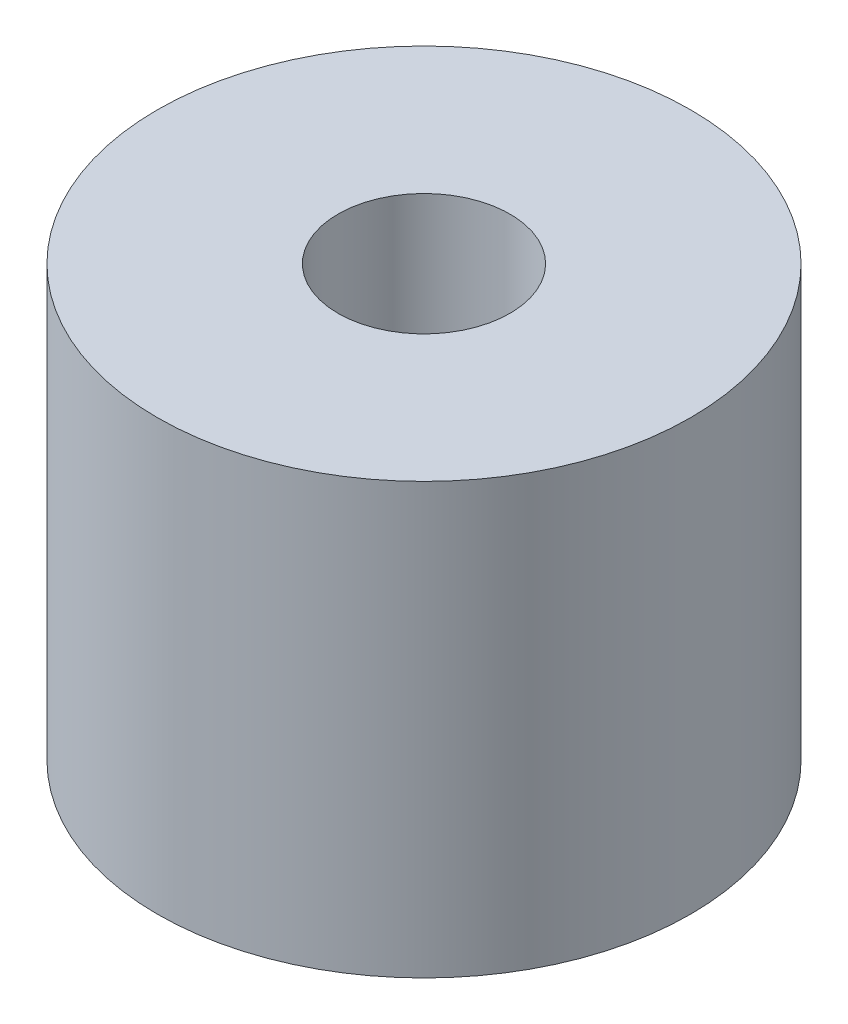
ISO-10303-21;
HEADER;
FILE_DESCRIPTION(('STEP AP214'),'2;1');
FILE_NAME('part.step','',(''),(''),'','','');
FILE_SCHEMA(('AUTOMOTIVE_DESIGN { 1 0 10303 214 1 1 1 1 }'));
ENDSEC;
DATA;
#1=APPLICATION_CONTEXT('core data for automotive mechanical design processes');
#2=APPLICATION_PROTOCOL_DEFINITION('international standard','automotive_design',2000,#1);
#3=PRODUCT_CONTEXT('',#1,'mechanical');
#4=PRODUCT('Part','Part','',(#3));
#5=PRODUCT_RELATED_PRODUCT_CATEGORY('part','',(#4));
#6=PRODUCT_DEFINITION_FORMATION('','',#4);
#7=PRODUCT_DEFINITION_CONTEXT('part definition',#1,'design');
#8=PRODUCT_DEFINITION('design','',#6,#7);
#9=PRODUCT_DEFINITION_SHAPE('','',#8);
#10=(LENGTH_UNIT() NAMED_UNIT(*) SI_UNIT(.MILLI.,.METRE.));
#11=(NAMED_UNIT(*) PLANE_ANGLE_UNIT() SI_UNIT($,.RADIAN.));
#12=(NAMED_UNIT(*) SI_UNIT($,.STERADIAN.) SOLID_ANGLE_UNIT());
#13=UNCERTAINTY_MEASURE_WITH_UNIT(LENGTH_MEASURE(1.E-05),#10,'distance_accuracy_value','');
#14=(GEOMETRIC_REPRESENTATION_CONTEXT(3) GLOBAL_UNCERTAINTY_ASSIGNED_CONTEXT((#13)) GLOBAL_UNIT_ASSIGNED_CONTEXT((#10,
#11,#12)) REPRESENTATION_CONTEXT('',''));
#15=CARTESIAN_POINT('',(0.,0.,0.));
#16=DIRECTION('',(0.,0.,1.));
#17=DIRECTION('',(1.,0.,0.));
#18=AXIS2_PLACEMENT_3D('',#15,#16,#17);
#19=CARTESIAN_POINT('',(0.,12.5,0.));
#20=DIRECTION('',(0.,-1.,0.));
#21=DIRECTION('',(0.,0.,-1.));
#22=AXIS2_PLACEMENT_3D('',#19,#20,#21);
#23=CYLINDRICAL_SURFACE('',#22,15.5);
#24=CARTESIAN_POINT('',(0.,12.5,0.));
#25=DIRECTION('',(0.,1.,0.));
#26=DIRECTION('',(0.,0.,1.));
#27=AXIS2_PLACEMENT_3D('',#24,#25,#26);
#28=CIRCLE('',#27,15.5);
#29=CARTESIAN_POINT('',(0.,12.5,15.5));
#30=VERTEX_POINT('',#29);
#31=EDGE_CURVE('E10',#30,#30,#28,.T.);
#32=ORIENTED_EDGE('',*,*,#31,.F.);
#33=EDGE_LOOP('',(#32));
#34=FACE_BOUND('',#33,.T.);
#35=CARTESIAN_POINT('',(0.,-12.5,0.));
#36=DIRECTION('',(0.,1.,0.));
#37=DIRECTION('',(0.,0.,1.));
#38=AXIS2_PLACEMENT_3D('',#35,#36,#37);
#39=CIRCLE('',#38,15.5);
#40=CARTESIAN_POINT('',(0.,-12.5,15.5));
#41=VERTEX_POINT('',#40);
#42=EDGE_CURVE('E36',#41,#41,#39,.T.);
#43=ORIENTED_EDGE('',*,*,#42,.T.);
#44=EDGE_LOOP('',(#43));
#45=FACE_BOUND('',#44,.T.);
#46=ADVANCED_FACE('F33',(#34,#45),#23,.T.);
#47=CARTESIAN_POINT('',(0.,12.5,0.));
#48=DIRECTION('',(0.,1.,0.));
#49=DIRECTION('',(0.,0.,1.));
#50=AXIS2_PLACEMENT_3D('',#47,#48,#49);
#51=PLANE('',#50);
#52=CARTESIAN_POINT('',(0.,12.5,0.));
#53=DIRECTION('',(0.,1.,0.));
#54=DIRECTION('',(0.,0.,1.));
#55=AXIS2_PLACEMENT_3D('',#52,#53,#54);
#56=CIRCLE('',#55,5.);
#57=CARTESIAN_POINT('',(0.,12.5,5.));
#58=VERTEX_POINT('',#57);
#59=EDGE_CURVE('E47',#58,#58,#56,.T.);
#60=ORIENTED_EDGE('',*,*,#59,.F.);
#61=EDGE_LOOP('',(#60));
#62=FACE_BOUND('',#61,.T.);
#63=ORIENTED_EDGE('',*,*,#31,.T.);
#64=EDGE_LOOP('',(#63));
#65=FACE_BOUND('',#64,.T.);
#66=ADVANCED_FACE('F53',(#62,#65),#51,.T.);
#67=CARTESIAN_POINT('',(0.,-12.5,0.));
#68=DIRECTION('',(0.,1.,0.));
#69=DIRECTION('',(0.,0.,1.));
#70=AXIS2_PLACEMENT_3D('',#67,#68,#69);
#71=PLANE('',#70);
#72=CARTESIAN_POINT('',(0.,-12.5,0.));
#73=DIRECTION('',(0.,1.,0.));
#74=DIRECTION('',(0.,0.,1.));
#75=AXIS2_PLACEMENT_3D('',#72,#73,#74);
#76=CIRCLE('',#75,4.99999999999999);
#77=CARTESIAN_POINT('',(0.,-12.5,4.99999999999999));
#78=VERTEX_POINT('',#77);
#79=EDGE_CURVE('E43',#78,#78,#76,.T.);
#80=ORIENTED_EDGE('',*,*,#79,.T.);
#81=EDGE_LOOP('',(#80));
#82=FACE_BOUND('',#81,.T.);
#83=ORIENTED_EDGE('',*,*,#42,.F.);
#84=EDGE_LOOP('',(#83));
#85=FACE_BOUND('',#84,.T.);
#86=ADVANCED_FACE('F55',(#82,#85),#71,.F.);
#87=CARTESIAN_POINT('',(0.,12.5,0.));
#88=DIRECTION('',(0.,1.,0.));
#89=DIRECTION('',(0.,0.,1.));
#90=AXIS2_PLACEMENT_3D('',#87,#88,#89);
#91=CYLINDRICAL_SURFACE('',#90,5.);
#92=ORIENTED_EDGE('',*,*,#79,.F.);
#93=EDGE_LOOP('',(#92));
#94=FACE_BOUND('',#93,.T.);
#95=ORIENTED_EDGE('',*,*,#59,.T.);
#96=EDGE_LOOP('',(#95));
#97=FACE_BOUND('',#96,.T.);
#98=ADVANCED_FACE('F51',(#94,#97),#91,.F.);
#99=CLOSED_SHELL('',(#46,#66,#86,#98));
#100=MANIFOLD_SOLID_BREP('B2',#99);
#101=ADVANCED_BREP_SHAPE_REPRESENTATION('',(#18,#100),#14);
#102=SHAPE_DEFINITION_REPRESENTATION(#9,#101);
ENDSEC;
END-ISO-10303-21;
